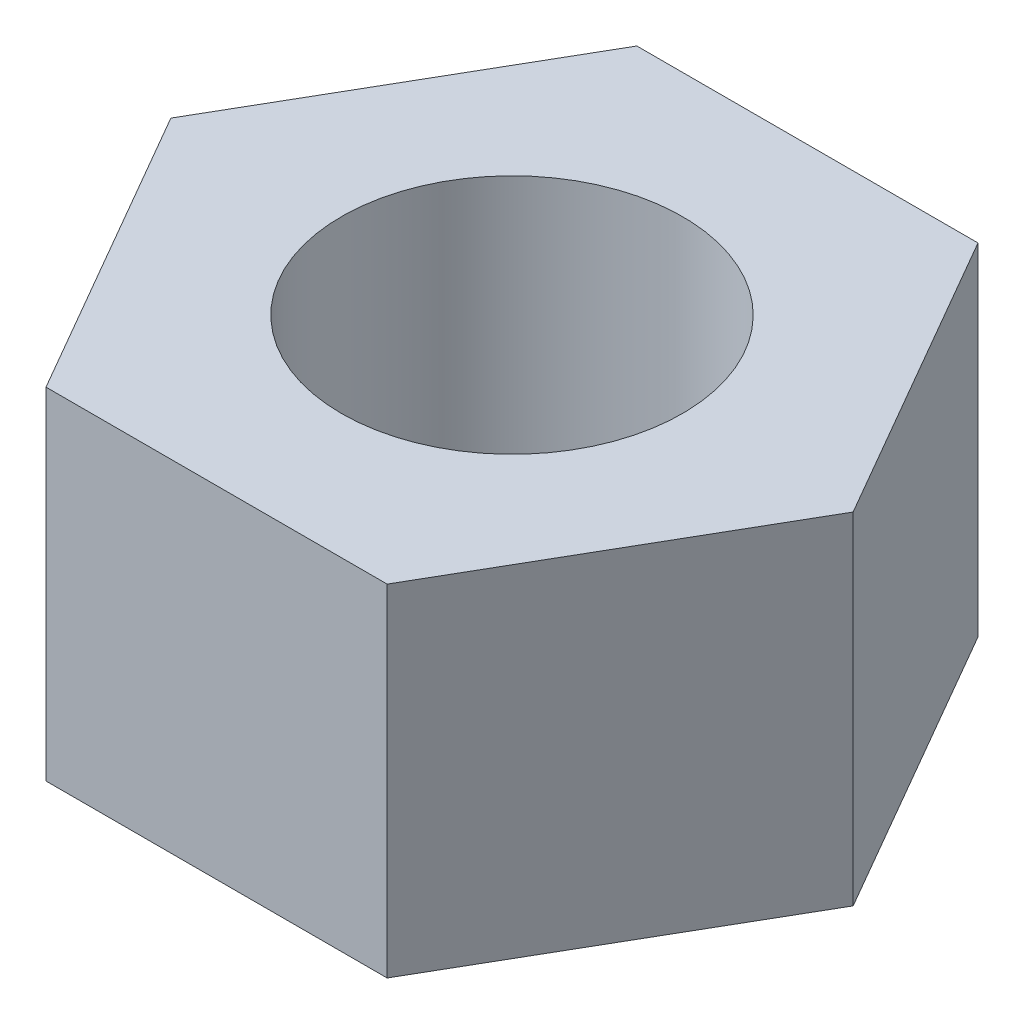
ISO-10303-21;
HEADER;
FILE_DESCRIPTION(('STEP AP214'),'2;1');
FILE_NAME('part.step','',(''),(''),'','','');
FILE_SCHEMA(('AUTOMOTIVE_DESIGN { 1 0 10303 214 1 1 1 1 }'));
ENDSEC;
DATA;
#1=APPLICATION_CONTEXT('core data for automotive mechanical design processes');
#2=APPLICATION_PROTOCOL_DEFINITION('international standard','automotive_design',2000,#1);
#3=PRODUCT_CONTEXT('',#1,'mechanical');
#4=PRODUCT('Part','Part','',(#3));
#5=PRODUCT_RELATED_PRODUCT_CATEGORY('part','',(#4));
#6=PRODUCT_DEFINITION_FORMATION('','',#4);
#7=PRODUCT_DEFINITION_CONTEXT('part definition',#1,'design');
#8=PRODUCT_DEFINITION('design','',#6,#7);
#9=PRODUCT_DEFINITION_SHAPE('','',#8);
#10=(LENGTH_UNIT() NAMED_UNIT(*) SI_UNIT(.MILLI.,.METRE.));
#11=(NAMED_UNIT(*) PLANE_ANGLE_UNIT() SI_UNIT($,.RADIAN.));
#12=(NAMED_UNIT(*) SI_UNIT($,.STERADIAN.) SOLID_ANGLE_UNIT());
#13=UNCERTAINTY_MEASURE_WITH_UNIT(LENGTH_MEASURE(1.E-05),#10,'distance_accuracy_value','');
#14=(GEOMETRIC_REPRESENTATION_CONTEXT(3) GLOBAL_UNCERTAINTY_ASSIGNED_CONTEXT((#13)) GLOBAL_UNIT_ASSIGNED_CONTEXT((#10,
#11,#12)) REPRESENTATION_CONTEXT('',''));
#15=CARTESIAN_POINT('',(0.,0.,0.));
#16=DIRECTION('',(0.,0.,1.));
#17=DIRECTION('',(1.,0.,0.));
#18=AXIS2_PLACEMENT_3D('',#15,#16,#17);
#19=CARTESIAN_POINT('',(-5.99999999999999,12.,10.3923048454133));
#20=DIRECTION('',(0.,0.,-1.));
#21=DIRECTION('',(-1.,0.,0.));
#22=AXIS2_PLACEMENT_3D('',#19,#20,#21);
#23=PLANE('',#22);
#24=DIRECTION('',(1.,0.,0.));
#25=VECTOR('',#24,1.);
#26=CARTESIAN_POINT('',(-5.99999999999999,0.,10.3923048454133));
#27=LINE('',#26,#25);
#28=CARTESIAN_POINT('',(-5.99999999999999,0.,10.3923048454133));
#29=VERTEX_POINT('',#28);
#30=CARTESIAN_POINT('',(6.,0.,10.3923048454133));
#31=VERTEX_POINT('',#30);
#32=EDGE_CURVE('E125',#29,#31,#27,.T.);
#33=ORIENTED_EDGE('',*,*,#32,.T.);
#34=DIRECTION('',(0.,-1.,0.));
#35=VECTOR('',#34,1.);
#36=CARTESIAN_POINT('',(6.,12.,10.3923048454133));
#37=LINE('',#36,#35);
#38=CARTESIAN_POINT('',(6.,12.,10.3923048454133));
#39=VERTEX_POINT('',#38);
#40=EDGE_CURVE('E11',#39,#31,#37,.T.);
#41=ORIENTED_EDGE('',*,*,#40,.F.);
#42=DIRECTION('',(1.,0.,0.));
#43=VECTOR('',#42,1.);
#44=CARTESIAN_POINT('',(-5.99999999999999,12.,10.3923048454133));
#45=LINE('',#44,#43);
#46=CARTESIAN_POINT('',(-5.99999999999999,12.,10.3923048454133));
#47=VERTEX_POINT('',#46);
#48=EDGE_CURVE('E136',#47,#39,#45,.T.);
#49=ORIENTED_EDGE('',*,*,#48,.F.);
#50=DIRECTION('',(0.,-1.,0.));
#51=VECTOR('',#50,1.);
#52=CARTESIAN_POINT('',(-5.99999999999999,12.,10.3923048454133));
#53=LINE('',#52,#51);
#54=EDGE_CURVE('E121',#47,#29,#53,.T.);
#55=ORIENTED_EDGE('',*,*,#54,.T.);
#56=EDGE_LOOP('',(#33,#41,#49,#55));
#57=FACE_BOUND('',#56,.T.);
#58=ADVANCED_FACE('F41',(#57),#23,.F.);
#59=CARTESIAN_POINT('',(6.,12.,10.3923048454133));
#60=DIRECTION('',(-0.866025403784439,0.,-0.5));
#61=DIRECTION('',(-0.5,0.,0.866025403784439));
#62=AXIS2_PLACEMENT_3D('',#59,#60,#61);
#63=PLANE('',#62);
#64=DIRECTION('',(0.5,0.,-0.866025403784439));
#65=VECTOR('',#64,1.);
#66=CARTESIAN_POINT('',(6.,0.,10.3923048454133));
#67=LINE('',#66,#65);
#68=CARTESIAN_POINT('',(12.,0.,0.));
#69=VERTEX_POINT('',#68);
#70=EDGE_CURVE('E128',#31,#69,#67,.T.);
#71=ORIENTED_EDGE('',*,*,#70,.T.);
#72=DIRECTION('',(0.,-1.,0.));
#73=VECTOR('',#72,1.);
#74=CARTESIAN_POINT('',(12.,12.,0.));
#75=LINE('',#74,#73);
#76=CARTESIAN_POINT('',(12.,12.,0.));
#77=VERTEX_POINT('',#76);
#78=EDGE_CURVE('E49',#77,#69,#75,.T.);
#79=ORIENTED_EDGE('',*,*,#78,.F.);
#80=DIRECTION('',(0.5,0.,-0.866025403784439));
#81=VECTOR('',#80,1.);
#82=CARTESIAN_POINT('',(6.,12.,10.3923048454133));
#83=LINE('',#82,#81);
#84=EDGE_CURVE('E94',#39,#77,#83,.T.);
#85=ORIENTED_EDGE('',*,*,#84,.F.);
#86=ORIENTED_EDGE('',*,*,#40,.T.);
#87=EDGE_LOOP('',(#71,#79,#85,#86));
#88=FACE_BOUND('',#87,.T.);
#89=ADVANCED_FACE('F161',(#88),#63,.F.);
#90=CARTESIAN_POINT('',(12.,12.,0.));
#91=DIRECTION('',(-0.866025403784439,0.,0.5));
#92=DIRECTION('',(0.5,0.,0.866025403784439));
#93=AXIS2_PLACEMENT_3D('',#90,#91,#92);
#94=PLANE('',#93);
#95=DIRECTION('',(-0.5,0.,-0.866025403784438));
#96=VECTOR('',#95,1.);
#97=CARTESIAN_POINT('',(12.,0.,0.));
#98=LINE('',#97,#96);
#99=CARTESIAN_POINT('',(6.,0.,-10.3923048454133));
#100=VERTEX_POINT('',#99);
#101=EDGE_CURVE('E131',#69,#100,#98,.T.);
#102=ORIENTED_EDGE('',*,*,#101,.T.);
#103=DIRECTION('',(0.,-1.,0.));
#104=VECTOR('',#103,1.);
#105=CARTESIAN_POINT('',(6.,12.,-10.3923048454133));
#106=LINE('',#105,#104);
#107=CARTESIAN_POINT('',(6.,12.,-10.3923048454133));
#108=VERTEX_POINT('',#107);
#109=EDGE_CURVE('E116',#108,#100,#106,.T.);
#110=ORIENTED_EDGE('',*,*,#109,.F.);
#111=DIRECTION('',(-0.5,0.,-0.866025403784438));
#112=VECTOR('',#111,1.);
#113=CARTESIAN_POINT('',(12.,12.,0.));
#114=LINE('',#113,#112);
#115=EDGE_CURVE('E107',#77,#108,#114,.T.);
#116=ORIENTED_EDGE('',*,*,#115,.F.);
#117=ORIENTED_EDGE('',*,*,#78,.T.);
#118=EDGE_LOOP('',(#102,#110,#116,#117));
#119=FACE_BOUND('',#118,.T.);
#120=ADVANCED_FACE('F142',(#119),#94,.F.);
#121=CARTESIAN_POINT('',(6.,12.,-10.3923048454133));
#122=DIRECTION('',(0.,0.,1.));
#123=DIRECTION('',(1.,0.,0.));
#124=AXIS2_PLACEMENT_3D('',#121,#122,#123);
#125=PLANE('',#124);
#126=DIRECTION('',(-1.,0.,0.));
#127=VECTOR('',#126,1.);
#128=CARTESIAN_POINT('',(6.,0.,-10.3923048454133));
#129=LINE('',#128,#127);
#130=CARTESIAN_POINT('',(-6.,0.,-10.3923048454133));
#131=VERTEX_POINT('',#130);
#132=EDGE_CURVE('E115',#100,#131,#129,.T.);
#133=ORIENTED_EDGE('',*,*,#132,.T.);
#134=DIRECTION('',(0.,-1.,0.));
#135=VECTOR('',#134,1.);
#136=CARTESIAN_POINT('',(-6.,12.,-10.3923048454133));
#137=LINE('',#136,#135);
#138=CARTESIAN_POINT('',(-6.,12.,-10.3923048454133));
#139=VERTEX_POINT('',#138);
#140=EDGE_CURVE('E112',#139,#131,#137,.T.);
#141=ORIENTED_EDGE('',*,*,#140,.F.);
#142=DIRECTION('',(-1.,0.,0.));
#143=VECTOR('',#142,1.);
#144=CARTESIAN_POINT('',(6.,12.,-10.3923048454133));
#145=LINE('',#144,#143);
#146=EDGE_CURVE('E101',#108,#139,#145,.T.);
#147=ORIENTED_EDGE('',*,*,#146,.F.);
#148=ORIENTED_EDGE('',*,*,#109,.T.);
#149=EDGE_LOOP('',(#133,#141,#147,#148));
#150=FACE_BOUND('',#149,.T.);
#151=ADVANCED_FACE('F113',(#150),#125,.F.);
#152=CARTESIAN_POINT('',(-6.,12.,-10.3923048454133));
#153=DIRECTION('',(0.866025403784439,0.,0.5));
#154=DIRECTION('',(0.5,0.,-0.866025403784439));
#155=AXIS2_PLACEMENT_3D('',#152,#153,#154);
#156=PLANE('',#155);
#157=DIRECTION('',(-0.5,0.,0.866025403784439));
#158=VECTOR('',#157,1.);
#159=CARTESIAN_POINT('',(-6.,0.,-10.3923048454133));
#160=LINE('',#159,#158);
#161=CARTESIAN_POINT('',(-12.,0.,0.));
#162=VERTEX_POINT('',#161);
#163=EDGE_CURVE('E80',#131,#162,#160,.T.);
#164=ORIENTED_EDGE('',*,*,#163,.T.);
#165=DIRECTION('',(0.,-1.,0.));
#166=VECTOR('',#165,1.);
#167=CARTESIAN_POINT('',(-12.,12.,0.));
#168=LINE('',#167,#166);
#169=CARTESIAN_POINT('',(-12.,12.,0.));
#170=VERTEX_POINT('',#169);
#171=EDGE_CURVE('E117',#170,#162,#168,.T.);
#172=ORIENTED_EDGE('',*,*,#171,.F.);
#173=DIRECTION('',(-0.5,0.,0.866025403784439));
#174=VECTOR('',#173,1.);
#175=CARTESIAN_POINT('',(-6.,12.,-10.3923048454133));
#176=LINE('',#175,#174);
#177=EDGE_CURVE('E105',#139,#170,#176,.T.);
#178=ORIENTED_EDGE('',*,*,#177,.F.);
#179=ORIENTED_EDGE('',*,*,#140,.T.);
#180=EDGE_LOOP('',(#164,#172,#178,#179));
#181=FACE_BOUND('',#180,.T.);
#182=ADVANCED_FACE('F119',(#181),#156,.F.);
#183=CARTESIAN_POINT('',(-12.,12.,0.));
#184=DIRECTION('',(0.866025403784438,0.,-0.5));
#185=DIRECTION('',(-0.5,0.,-0.866025403784438));
#186=AXIS2_PLACEMENT_3D('',#183,#184,#185);
#187=PLANE('',#186);
#188=DIRECTION('',(0.5,0.,0.866025403784438));
#189=VECTOR('',#188,1.);
#190=CARTESIAN_POINT('',(-12.,0.,0.));
#191=LINE('',#190,#189);
#192=EDGE_CURVE('E86',#162,#29,#191,.T.);
#193=ORIENTED_EDGE('',*,*,#192,.T.);
#194=ORIENTED_EDGE('',*,*,#54,.F.);
#195=DIRECTION('',(0.5,0.,0.866025403784438));
#196=VECTOR('',#195,1.);
#197=CARTESIAN_POINT('',(-12.,12.,0.));
#198=LINE('',#197,#196);
#199=EDGE_CURVE('E57',#170,#47,#198,.T.);
#200=ORIENTED_EDGE('',*,*,#199,.F.);
#201=ORIENTED_EDGE('',*,*,#171,.T.);
#202=EDGE_LOOP('',(#193,#194,#200,#201));
#203=FACE_BOUND('',#202,.T.);
#204=ADVANCED_FACE('F149',(#203),#187,.F.);
#205=CARTESIAN_POINT('',(0.,12.,0.));
#206=DIRECTION('',(0.,1.,0.));
#207=DIRECTION('',(0.,0.,1.));
#208=AXIS2_PLACEMENT_3D('',#205,#206,#207);
#209=PLANE('',#208);
#210=CARTESIAN_POINT('',(0.,12.,0.));
#211=DIRECTION('',(0.,1.,0.));
#212=DIRECTION('',(0.,0.,1.));
#213=AXIS2_PLACEMENT_3D('',#210,#211,#212);
#214=CIRCLE('',#213,6.);
#215=CARTESIAN_POINT('',(0.,12.,6.));
#216=VERTEX_POINT('',#215);
#217=EDGE_CURVE('E248',#216,#216,#214,.T.);
#218=ORIENTED_EDGE('',*,*,#217,.F.);
#219=EDGE_LOOP('',(#218));
#220=FACE_BOUND('',#219,.T.);
#221=ORIENTED_EDGE('',*,*,#48,.T.);
#222=ORIENTED_EDGE('',*,*,#84,.T.);
#223=ORIENTED_EDGE('',*,*,#115,.T.);
#224=ORIENTED_EDGE('',*,*,#146,.T.);
#225=ORIENTED_EDGE('',*,*,#177,.T.);
#226=ORIENTED_EDGE('',*,*,#199,.T.);
#227=EDGE_LOOP('',(#221,#222,#223,#224,#225,#226));
#228=FACE_BOUND('',#227,.T.);
#229=ADVANCED_FACE('F103',(#220,#228),#209,.T.);
#230=CARTESIAN_POINT('',(0.,0.,0.));
#231=DIRECTION('',(0.,1.,0.));
#232=DIRECTION('',(0.,0.,1.));
#233=AXIS2_PLACEMENT_3D('',#230,#231,#232);
#234=PLANE('',#233);
#235=CARTESIAN_POINT('',(0.,0.,0.));
#236=DIRECTION('',(0.,1.,0.));
#237=DIRECTION('',(0.,0.,1.));
#238=AXIS2_PLACEMENT_3D('',#235,#236,#237);
#239=CIRCLE('',#238,6.);
#240=CARTESIAN_POINT('',(0.,0.,6.));
#241=VERTEX_POINT('',#240);
#242=EDGE_CURVE('E129',#241,#241,#239,.F.);
#243=ORIENTED_EDGE('',*,*,#242,.F.);
#244=EDGE_LOOP('',(#243));
#245=FACE_BOUND('',#244,.T.);
#246=ORIENTED_EDGE('',*,*,#32,.F.);
#247=ORIENTED_EDGE('',*,*,#192,.F.);
#248=ORIENTED_EDGE('',*,*,#163,.F.);
#249=ORIENTED_EDGE('',*,*,#132,.F.);
#250=ORIENTED_EDGE('',*,*,#101,.F.);
#251=ORIENTED_EDGE('',*,*,#70,.F.);
#252=EDGE_LOOP('',(#246,#247,#248,#249,#250,#251));
#253=FACE_BOUND('',#252,.T.);
#254=ADVANCED_FACE('F145',(#245,#253),#234,.F.);
#255=CARTESIAN_POINT('',(0.,-16.9705627484771,0.));
#256=DIRECTION('',(0.,1.,0.));
#257=DIRECTION('',(0.,0.,1.));
#258=AXIS2_PLACEMENT_3D('',#255,#256,#257);
#259=CYLINDRICAL_SURFACE('',#258,6.);
#260=CARTESIAN_POINT('',(0.,0.,6.));
#261=CARTESIAN_POINT('',(0.,0.124999999999997,6.));
#262=CARTESIAN_POINT('',(0.,0.249999999999997,6.));
#263=CARTESIAN_POINT('',(0.,0.499999999999997,6.));
#264=CARTESIAN_POINT('',(0.,0.624999999999997,6.));
#265=CARTESIAN_POINT('',(0.,0.874999999999997,6.));
#266=CARTESIAN_POINT('',(0.,0.999999999999997,6.));
#267=CARTESIAN_POINT('',(0.,1.25,6.));
#268=CARTESIAN_POINT('',(0.,1.375,6.));
#269=CARTESIAN_POINT('',(0.,1.625,6.));
#270=CARTESIAN_POINT('',(0.,1.75,6.));
#271=CARTESIAN_POINT('',(0.,2.,6.));
#272=CARTESIAN_POINT('',(0.,2.125,6.));
#273=CARTESIAN_POINT('',(0.,2.375,6.));
#274=CARTESIAN_POINT('',(0.,2.5,6.));
#275=CARTESIAN_POINT('',(0.,2.75,6.));
#276=CARTESIAN_POINT('',(0.,2.875,6.));
#277=CARTESIAN_POINT('',(0.,3.125,6.));
#278=CARTESIAN_POINT('',(0.,3.25,6.));
#279=CARTESIAN_POINT('',(0.,3.5,6.));
#280=CARTESIAN_POINT('',(0.,3.625,6.));
#281=CARTESIAN_POINT('',(0.,3.875,6.));
#282=CARTESIAN_POINT('',(0.,4.,6.));
#283=CARTESIAN_POINT('',(0.,4.25,6.));
#284=CARTESIAN_POINT('',(0.,4.375,6.));
#285=CARTESIAN_POINT('',(0.,4.625,6.));
#286=CARTESIAN_POINT('',(0.,4.75,6.));
#287=CARTESIAN_POINT('',(0.,5.,6.));
#288=CARTESIAN_POINT('',(0.,5.125,6.));
#289=CARTESIAN_POINT('',(0.,5.375,6.));
#290=CARTESIAN_POINT('',(0.,5.5,6.));
#291=CARTESIAN_POINT('',(0.,5.75,6.));
#292=CARTESIAN_POINT('',(0.,5.875,6.));
#293=CARTESIAN_POINT('',(0.,6.125,6.));
#294=CARTESIAN_POINT('',(0.,6.25,6.));
#295=CARTESIAN_POINT('',(0.,6.5,6.));
#296=CARTESIAN_POINT('',(0.,6.625,6.));
#297=CARTESIAN_POINT('',(0.,6.875,6.));
#298=CARTESIAN_POINT('',(0.,7.,6.));
#299=CARTESIAN_POINT('',(0.,7.25,6.));
#300=CARTESIAN_POINT('',(0.,7.375,6.));
#301=CARTESIAN_POINT('',(0.,7.625,6.));
#302=CARTESIAN_POINT('',(0.,7.75,6.));
#303=CARTESIAN_POINT('',(0.,8.,6.));
#304=CARTESIAN_POINT('',(0.,8.125,6.));
#305=CARTESIAN_POINT('',(0.,8.375,6.));
#306=CARTESIAN_POINT('',(0.,8.5,6.));
#307=CARTESIAN_POINT('',(0.,8.75,6.));
#308=CARTESIAN_POINT('',(0.,8.875,6.));
#309=CARTESIAN_POINT('',(0.,9.125,6.));
#310=CARTESIAN_POINT('',(0.,9.25,6.));
#311=CARTESIAN_POINT('',(0.,9.5,6.));
#312=CARTESIAN_POINT('',(0.,9.625,6.));
#313=CARTESIAN_POINT('',(0.,9.875,6.));
#314=CARTESIAN_POINT('',(0.,10.,6.));
#315=CARTESIAN_POINT('',(0.,10.25,6.));
#316=CARTESIAN_POINT('',(0.,10.375,6.));
#317=CARTESIAN_POINT('',(0.,10.625,6.));
#318=CARTESIAN_POINT('',(0.,10.75,6.));
#319=CARTESIAN_POINT('',(0.,11.,6.));
#320=CARTESIAN_POINT('',(0.,11.125,6.));
#321=CARTESIAN_POINT('',(0.,11.375,6.));
#322=CARTESIAN_POINT('',(0.,11.5,6.));
#323=CARTESIAN_POINT('',(0.,11.75,6.));
#324=CARTESIAN_POINT('',(0.,11.875,6.));
#325=CARTESIAN_POINT('',(0.,12.,6.));
#326=B_SPLINE_CURVE_WITH_KNOTS('',3,(#260,#261,#262,#263,#264,#265,#266,#267,#268,#269,#270,
#271,#272,#273,#274,#275,#276,#277,#278,#279,#280,#281,#282,#283,#284,#285,#286,#287,#288,#289,
#290,#291,#292,#293,#294,#295,#296,#297,#298,#299,#300,#301,#302,#303,#304,#305,#306,#307,#308,
#309,#310,#311,#312,#313,#314,#315,#316,#317,#318,#319,#320,#321,#322,#323,#324,#325),
.UNSPECIFIED.,.F.,.F.,(4,2,2,2,2,2,2,2,2,2,2,2,2,2,2,2,2,2,2,2,2,2,2,2,2,2,2,2,2,2,2,2,4),(0.,
0.375,0.750000000000001,1.125,1.5,1.875,2.25,2.625,3.,3.375,3.75,4.125,4.5,4.875,5.25,5.625,6.,
6.375,6.75,7.125,7.5,7.875,8.25,8.625,9.,9.375,9.75,10.125,10.5,10.875,11.25,11.625,12.),.UNSPECIFIED.);
#327=EDGE_CURVE('BSEAM201',#241,#216,#326,.T.);
#328=ORIENTED_EDGE('',*,*,#242,.T.);
#329=ORIENTED_EDGE('',*,*,#217,.T.);
#330=ORIENTED_EDGE('',*,*,#327,.T.);
#331=ORIENTED_EDGE('',*,*,#327,.F.);
#332=EDGE_LOOP('',(#328,#330,#329,#331));
#333=FACE_BOUND('',#332,.T.);
#334=ADVANCED_FACE('F201',(#333),#259,.F.);
#335=CLOSED_SHELL('',(#58,#89,#120,#151,#182,#204,#229,#254,#334));
#336=MANIFOLD_SOLID_BREP('B2',#335);
#337=ADVANCED_BREP_SHAPE_REPRESENTATION('',(#18,#336),#14);
#338=SHAPE_DEFINITION_REPRESENTATION(#9,#337);
ENDSEC;
END-ISO-10303-21;
